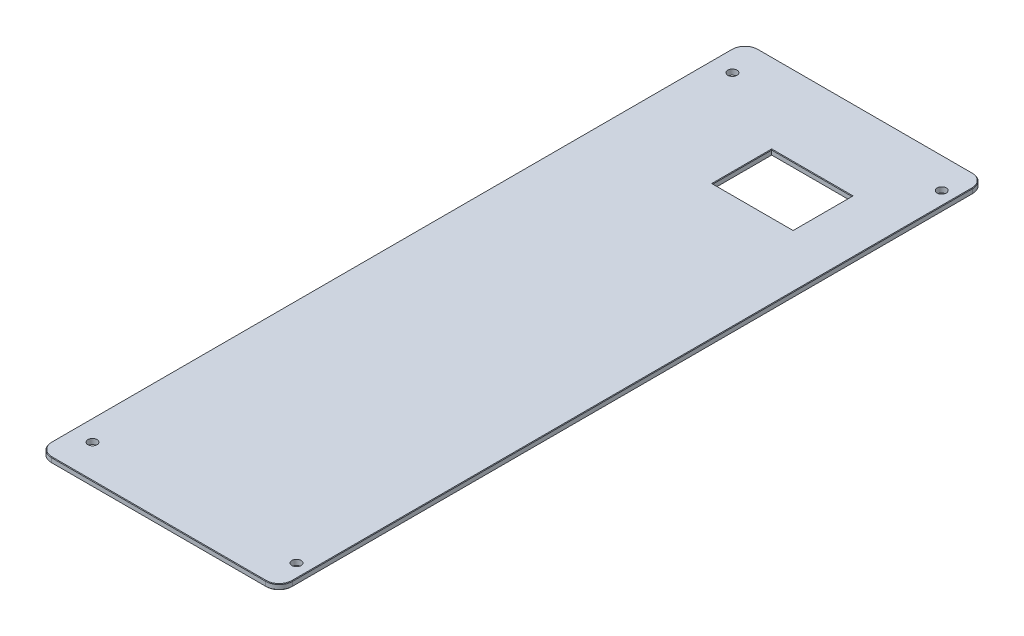
ISO-10303-21;
HEADER;
FILE_DESCRIPTION(('STEP AP214'),'2;1');
FILE_NAME('part.step','',(''),(''),'','','');
FILE_SCHEMA(('AUTOMOTIVE_DESIGN { 1 0 10303 214 1 1 1 1 }'));
ENDSEC;
DATA;
#1=APPLICATION_CONTEXT('core data for automotive mechanical design processes');
#2=APPLICATION_PROTOCOL_DEFINITION('international standard','automotive_design',2000,#1);
#3=PRODUCT_CONTEXT('',#1,'mechanical');
#4=PRODUCT('Part','Part','',(#3));
#5=PRODUCT_RELATED_PRODUCT_CATEGORY('part','',(#4));
#6=PRODUCT_DEFINITION_FORMATION('','',#4);
#7=PRODUCT_DEFINITION_CONTEXT('part definition',#1,'design');
#8=PRODUCT_DEFINITION('design','',#6,#7);
#9=PRODUCT_DEFINITION_SHAPE('','',#8);
#10=(LENGTH_UNIT() NAMED_UNIT(*) SI_UNIT(.MILLI.,.METRE.));
#11=(NAMED_UNIT(*) PLANE_ANGLE_UNIT() SI_UNIT($,.RADIAN.));
#12=(NAMED_UNIT(*) SI_UNIT($,.STERADIAN.) SOLID_ANGLE_UNIT());
#13=UNCERTAINTY_MEASURE_WITH_UNIT(LENGTH_MEASURE(1.E-05),#10,'distance_accuracy_value','');
#14=(GEOMETRIC_REPRESENTATION_CONTEXT(3) GLOBAL_UNCERTAINTY_ASSIGNED_CONTEXT((#13)) GLOBAL_UNIT_ASSIGNED_CONTEXT((#10,
#11,#12)) REPRESENTATION_CONTEXT('',''));
#15=CARTESIAN_POINT('',(0.,0.,0.));
#16=DIRECTION('',(0.,0.,1.));
#17=DIRECTION('',(1.,0.,0.));
#18=AXIS2_PLACEMENT_3D('',#15,#16,#17);
#19=CARTESIAN_POINT('',(0.,0.,264.));
#20=DIRECTION('',(-1.,0.,0.));
#21=DIRECTION('',(0.,0.,1.));
#22=AXIS2_PLACEMENT_3D('',#19,#20,#21);
#23=PLANE('',#22);
#24=DIRECTION('',(0.,1.,0.));
#25=VECTOR('',#24,1.);
#26=CARTESIAN_POINT('',(0.,0.,259.));
#27=LINE('',#26,#25);
#28=CARTESIAN_POINT('',(0.,0.200000000000001,259.));
#29=VERTEX_POINT('',#28);
#30=CARTESIAN_POINT('',(0.,1.8,259.));
#31=VERTEX_POINT('',#30);
#32=EDGE_CURVE('E412',#29,#31,#27,.T.);
#33=ORIENTED_EDGE('',*,*,#32,.T.);
#34=DIRECTION('',(0.,0.,-1.));
#35=VECTOR('',#34,1.);
#36=CARTESIAN_POINT('',(0.,1.8,5.));
#37=LINE('',#36,#35);
#38=CARTESIAN_POINT('',(0.,1.8,5.));
#39=VERTEX_POINT('',#38);
#40=EDGE_CURVE('E251',#31,#39,#37,.T.);
#41=ORIENTED_EDGE('',*,*,#40,.T.);
#42=DIRECTION('',(0.,1.,0.));
#43=VECTOR('',#42,1.);
#44=CARTESIAN_POINT('',(0.,0.,5.));
#45=LINE('',#44,#43);
#46=CARTESIAN_POINT('',(0.,0.200000000000001,5.));
#47=VERTEX_POINT('',#46);
#48=EDGE_CURVE('E409',#39,#47,#45,.F.);
#49=ORIENTED_EDGE('',*,*,#48,.T.);
#50=DIRECTION('',(0.,0.,1.));
#51=VECTOR('',#50,1.);
#52=CARTESIAN_POINT('',(0.,0.200000000000001,259.));
#53=LINE('',#52,#51);
#54=EDGE_CURVE('E249',#47,#29,#53,.T.);
#55=ORIENTED_EDGE('',*,*,#54,.T.);
#56=EDGE_LOOP('',(#33,#41,#49,#55));
#57=FACE_BOUND('',#56,.T.);
#58=ADVANCED_FACE('F30',(#57),#23,.T.);
#59=CARTESIAN_POINT('',(0.,0.,264.));
#60=DIRECTION('',(0.,1.,0.));
#61=DIRECTION('',(0.,0.,1.));
#62=AXIS2_PLACEMENT_3D('',#59,#60,#61);
#63=PLANE('',#62);
#64=CARTESIAN_POINT('',(85.,0.,11.5));
#65=DIRECTION('',(0.,1.,0.));
#66=DIRECTION('',(-1.,0.,0.));
#67=AXIS2_PLACEMENT_3D('',#64,#65,#66);
#68=CIRCLE('',#67,1.7);
#69=CARTESIAN_POINT('',(83.3,0.,11.5));
#70=VERTEX_POINT('',#69);
#71=EDGE_CURVE('E601',#70,#70,#68,.T.);
#72=ORIENTED_EDGE('',*,*,#71,.T.);
#73=EDGE_LOOP('',(#72));
#74=FACE_BOUND('',#73,.T.);
#75=CARTESIAN_POINT('',(85.,0.,252.5));
#76=DIRECTION('',(0.,1.,0.));
#77=DIRECTION('',(-1.,0.,0.));
#78=AXIS2_PLACEMENT_3D('',#75,#76,#77);
#79=CIRCLE('',#78,1.69999999999999);
#80=CARTESIAN_POINT('',(83.3,0.,252.5));
#81=VERTEX_POINT('',#80);
#82=EDGE_CURVE('E597',#81,#81,#79,.T.);
#83=ORIENTED_EDGE('',*,*,#82,.T.);
#84=EDGE_LOOP('',(#83));
#85=FACE_BOUND('',#84,.T.);
#86=CARTESIAN_POINT('',(7.82000000000003,0.,12.49));
#87=DIRECTION('',(0.,1.,0.));
#88=DIRECTION('',(-1.,0.,0.));
#89=AXIS2_PLACEMENT_3D('',#86,#87,#88);
#90=CIRCLE('',#89,1.7);
#91=CARTESIAN_POINT('',(6.12000000000003,0.,12.49));
#92=VERTEX_POINT('',#91);
#93=EDGE_CURVE('E592',#92,#92,#90,.T.);
#94=ORIENTED_EDGE('',*,*,#93,.T.);
#95=EDGE_LOOP('',(#94));
#96=FACE_BOUND('',#95,.T.);
#97=CARTESIAN_POINT('',(7.82,0.,251.51));
#98=DIRECTION('',(0.,1.,0.));
#99=DIRECTION('',(-1.,0.,0.));
#100=AXIS2_PLACEMENT_3D('',#97,#98,#99);
#101=CIRCLE('',#100,1.69999999999999);
#102=CARTESIAN_POINT('',(6.12000000000001,0.,251.51));
#103=VERTEX_POINT('',#102);
#104=EDGE_CURVE('E446',#103,#103,#101,.T.);
#105=ORIENTED_EDGE('',*,*,#104,.T.);
#106=EDGE_LOOP('',(#105));
#107=FACE_BOUND('',#106,.T.);
#108=DIRECTION('',(0.,0.,-1.));
#109=VECTOR('',#108,1.);
#110=CARTESIAN_POINT('',(0.200000000000004,0.,5.));
#111=LINE('',#110,#109);
#112=CARTESIAN_POINT('',(0.200000000000004,0.,259.));
#113=VERTEX_POINT('',#112);
#114=CARTESIAN_POINT('',(0.200000000000004,0.,5.));
#115=VERTEX_POINT('',#114);
#116=EDGE_CURVE('E37',#113,#115,#111,.T.);
#117=ORIENTED_EDGE('',*,*,#116,.T.);
#118=CARTESIAN_POINT('',(5.,0.,5.));
#119=DIRECTION('',(0.,1.,0.));
#120=DIRECTION('',(0.,0.,1.));
#121=AXIS2_PLACEMENT_3D('',#118,#119,#120);
#122=CIRCLE('',#121,4.8);
#123=CARTESIAN_POINT('',(5.,0.,0.199999999999978));
#124=VERTEX_POINT('',#123);
#125=EDGE_CURVE('E11',#115,#124,#122,.F.);
#126=ORIENTED_EDGE('',*,*,#125,.T.);
#127=DIRECTION('',(1.,0.,0.));
#128=VECTOR('',#127,1.);
#129=CARTESIAN_POINT('',(85.,0.,0.199999999999978));
#130=LINE('',#129,#128);
#131=CARTESIAN_POINT('',(85.,0.,0.199999999999978));
#132=VERTEX_POINT('',#131);
#133=EDGE_CURVE('E295',#124,#132,#130,.T.);
#134=ORIENTED_EDGE('',*,*,#133,.T.);
#135=CARTESIAN_POINT('',(85.,0.,5.));
#136=DIRECTION('',(0.,1.,0.));
#137=DIRECTION('',(0.,0.,1.));
#138=AXIS2_PLACEMENT_3D('',#135,#136,#137);
#139=CIRCLE('',#138,4.8);
#140=CARTESIAN_POINT('',(89.8,0.,5.));
#141=VERTEX_POINT('',#140);
#142=EDGE_CURVE('E297',#132,#141,#139,.F.);
#143=ORIENTED_EDGE('',*,*,#142,.T.);
#144=DIRECTION('',(0.,0.,1.));
#145=VECTOR('',#144,1.);
#146=CARTESIAN_POINT('',(89.8,0.,259.));
#147=LINE('',#146,#145);
#148=CARTESIAN_POINT('',(89.8,0.,259.));
#149=VERTEX_POINT('',#148);
#150=EDGE_CURVE('E299',#141,#149,#147,.T.);
#151=ORIENTED_EDGE('',*,*,#150,.T.);
#152=CARTESIAN_POINT('',(85.,0.,259.));
#153=DIRECTION('',(0.,1.,0.));
#154=DIRECTION('',(0.,0.,1.));
#155=AXIS2_PLACEMENT_3D('',#152,#153,#154);
#156=CIRCLE('',#155,4.79999999999997);
#157=CARTESIAN_POINT('',(85.,0.,263.8));
#158=VERTEX_POINT('',#157);
#159=EDGE_CURVE('E301',#149,#158,#156,.F.);
#160=ORIENTED_EDGE('',*,*,#159,.T.);
#161=DIRECTION('',(-1.,0.,0.));
#162=VECTOR('',#161,1.);
#163=CARTESIAN_POINT('',(0.,0.,263.8));
#164=LINE('',#163,#162);
#165=CARTESIAN_POINT('',(5.,0.,263.8));
#166=VERTEX_POINT('',#165);
#167=EDGE_CURVE('E303',#158,#166,#164,.T.);
#168=ORIENTED_EDGE('',*,*,#167,.T.);
#169=CARTESIAN_POINT('',(5.,0.,259.));
#170=DIRECTION('',(0.,1.,0.));
#171=DIRECTION('',(0.,0.,1.));
#172=AXIS2_PLACEMENT_3D('',#169,#170,#171);
#173=CIRCLE('',#172,4.8);
#174=EDGE_CURVE('E47',#166,#113,#173,.F.);
#175=ORIENTED_EDGE('',*,*,#174,.T.);
#176=EDGE_LOOP('',(#117,#126,#134,#143,#151,#160,#168,#175));
#177=FACE_BOUND('',#176,.T.);
#178=DIRECTION('',(-1.,0.,0.));
#179=VECTOR('',#178,1.);
#180=CARTESIAN_POINT('',(40.,0.,29.8));
#181=LINE('',#180,#179);
#182=CARTESIAN_POINT('',(70.2,0.,29.8));
#183=VERTEX_POINT('',#182);
#184=CARTESIAN_POINT('',(39.8,0.,29.8));
#185=VERTEX_POINT('',#184);
#186=EDGE_CURVE('E290',#183,#185,#181,.T.);
#187=ORIENTED_EDGE('',*,*,#186,.T.);
#188=DIRECTION('',(0.,0.,1.));
#189=VECTOR('',#188,1.);
#190=CARTESIAN_POINT('',(39.8,0.,264.));
#191=LINE('',#190,#189);
#192=CARTESIAN_POINT('',(39.8,0.,52.2));
#193=VERTEX_POINT('',#192);
#194=EDGE_CURVE('E292',#185,#193,#191,.T.);
#195=ORIENTED_EDGE('',*,*,#194,.T.);
#196=DIRECTION('',(1.,0.,0.));
#197=VECTOR('',#196,1.);
#198=CARTESIAN_POINT('',(70.,0.,52.2));
#199=LINE('',#198,#197);
#200=CARTESIAN_POINT('',(70.2,0.,52.2));
#201=VERTEX_POINT('',#200);
#202=EDGE_CURVE('E286',#193,#201,#199,.T.);
#203=ORIENTED_EDGE('',*,*,#202,.T.);
#204=DIRECTION('',(0.,0.,-1.));
#205=VECTOR('',#204,1.);
#206=CARTESIAN_POINT('',(70.2,0.,264.));
#207=LINE('',#206,#205);
#208=EDGE_CURVE('E288',#201,#183,#207,.T.);
#209=ORIENTED_EDGE('',*,*,#208,.T.);
#210=EDGE_LOOP('',(#187,#195,#203,#209));
#211=FACE_BOUND('',#210,.T.);
#212=ADVANCED_FACE('F307',(#74,#85,#96,#107,#177,#211),#63,.F.);
#213=CARTESIAN_POINT('',(90.,1.99999999999999,264.));
#214=DIRECTION('',(1.,0.,0.));
#215=DIRECTION('',(0.,0.,-1.));
#216=AXIS2_PLACEMENT_3D('',#213,#214,#215);
#217=PLANE('',#216);
#218=DIRECTION('',(0.,-1.,0.));
#219=VECTOR('',#218,1.);
#220=CARTESIAN_POINT('',(90.,1.99999999999999,5.));
#221=LINE('',#220,#219);
#222=CARTESIAN_POINT('',(90.,0.200000000000001,5.));
#223=VERTEX_POINT('',#222);
#224=CARTESIAN_POINT('',(90.,1.79999999999999,5.));
#225=VERTEX_POINT('',#224);
#226=EDGE_CURVE('E406',#223,#225,#221,.F.);
#227=ORIENTED_EDGE('',*,*,#226,.T.);
#228=DIRECTION('',(0.,0.,1.));
#229=VECTOR('',#228,1.);
#230=CARTESIAN_POINT('',(90.,1.79999999999999,259.));
#231=LINE('',#230,#229);
#232=CARTESIAN_POINT('',(90.,1.79999999999999,259.));
#233=VERTEX_POINT('',#232);
#234=EDGE_CURVE('E268',#225,#233,#231,.T.);
#235=ORIENTED_EDGE('',*,*,#234,.T.);
#236=DIRECTION('',(0.,-1.,0.));
#237=VECTOR('',#236,1.);
#238=CARTESIAN_POINT('',(90.,1.99999999999999,259.));
#239=LINE('',#238,#237);
#240=CARTESIAN_POINT('',(90.,0.200000000000004,259.));
#241=VERTEX_POINT('',#240);
#242=EDGE_CURVE('E403',#233,#241,#239,.T.);
#243=ORIENTED_EDGE('',*,*,#242,.T.);
#244=DIRECTION('',(0.,0.,-1.));
#245=VECTOR('',#244,1.);
#246=CARTESIAN_POINT('',(90.,0.200000000000004,5.));
#247=LINE('',#246,#245);
#248=EDGE_CURVE('E266',#241,#223,#247,.T.);
#249=ORIENTED_EDGE('',*,*,#248,.T.);
#250=EDGE_LOOP('',(#227,#235,#243,#249));
#251=FACE_BOUND('',#250,.T.);
#252=ADVANCED_FACE('F489',(#251),#217,.T.);
#253=CARTESIAN_POINT('',(90.,1.99999999999999,264.));
#254=DIRECTION('',(0.,-1.,0.));
#255=DIRECTION('',(1.,0.,0.));
#256=AXIS2_PLACEMENT_3D('',#253,#254,#255);
#257=PLANE('',#256);
#258=CARTESIAN_POINT('',(85.,1.99999999999999,11.5));
#259=DIRECTION('',(0.,1.,0.));
#260=DIRECTION('',(-1.,0.,0.));
#261=AXIS2_PLACEMENT_3D('',#258,#259,#260);
#262=CIRCLE('',#261,1.7);
#263=CARTESIAN_POINT('',(83.3,1.99999999999999,11.5));
#264=VERTEX_POINT('',#263);
#265=EDGE_CURVE('E580',#264,#264,#262,.T.);
#266=ORIENTED_EDGE('',*,*,#265,.F.);
#267=EDGE_LOOP('',(#266));
#268=FACE_BOUND('',#267,.T.);
#269=CARTESIAN_POINT('',(85.,1.99999999999999,252.5));
#270=DIRECTION('',(0.,1.,0.));
#271=DIRECTION('',(-1.,0.,0.));
#272=AXIS2_PLACEMENT_3D('',#269,#270,#271);
#273=CIRCLE('',#272,1.69999999999999);
#274=CARTESIAN_POINT('',(83.3,1.99999999999999,252.5));
#275=VERTEX_POINT('',#274);
#276=EDGE_CURVE('E584',#275,#275,#273,.T.);
#277=ORIENTED_EDGE('',*,*,#276,.F.);
#278=EDGE_LOOP('',(#277));
#279=FACE_BOUND('',#278,.T.);
#280=CARTESIAN_POINT('',(7.82000000000003,2.,12.49));
#281=DIRECTION('',(0.,1.,0.));
#282=DIRECTION('',(-1.,0.,0.));
#283=AXIS2_PLACEMENT_3D('',#280,#281,#282);
#284=CIRCLE('',#283,1.7);
#285=CARTESIAN_POINT('',(6.12000000000003,2.,12.49));
#286=VERTEX_POINT('',#285);
#287=EDGE_CURVE('E588',#286,#286,#284,.T.);
#288=ORIENTED_EDGE('',*,*,#287,.F.);
#289=EDGE_LOOP('',(#288));
#290=FACE_BOUND('',#289,.T.);
#291=CARTESIAN_POINT('',(7.82,2.,251.51));
#292=DIRECTION('',(0.,1.,0.));
#293=DIRECTION('',(-1.,0.,0.));
#294=AXIS2_PLACEMENT_3D('',#291,#292,#293);
#295=CIRCLE('',#294,1.69999999999999);
#296=CARTESIAN_POINT('',(6.12000000000001,2.,251.51));
#297=VERTEX_POINT('',#296);
#298=EDGE_CURVE('E450',#297,#297,#295,.T.);
#299=ORIENTED_EDGE('',*,*,#298,.F.);
#300=EDGE_LOOP('',(#299));
#301=FACE_BOUND('',#300,.T.);
#302=DIRECTION('',(1.,0.,0.));
#303=VECTOR('',#302,1.);
#304=CARTESIAN_POINT('',(90.,1.99999999999999,263.8));
#305=LINE('',#304,#303);
#306=CARTESIAN_POINT('',(5.,2.,263.8));
#307=VERTEX_POINT('',#306);
#308=CARTESIAN_POINT('',(85.,1.99999999999999,263.8));
#309=VERTEX_POINT('',#308);
#310=EDGE_CURVE('E231',#307,#309,#305,.T.);
#311=ORIENTED_EDGE('',*,*,#310,.T.);
#312=CARTESIAN_POINT('',(85.,1.99999999999999,259.));
#313=DIRECTION('',(0.,-1.,0.));
#314=DIRECTION('',(1.,0.,0.));
#315=AXIS2_PLACEMENT_3D('',#312,#313,#314);
#316=CIRCLE('',#315,4.8);
#317=CARTESIAN_POINT('',(89.8,1.99999999999999,259.));
#318=VERTEX_POINT('',#317);
#319=EDGE_CURVE('E233',#309,#318,#316,.F.);
#320=ORIENTED_EDGE('',*,*,#319,.T.);
#321=DIRECTION('',(0.,0.,-1.));
#322=VECTOR('',#321,1.);
#323=CARTESIAN_POINT('',(89.8,1.99999999999999,5.));
#324=LINE('',#323,#322);
#325=CARTESIAN_POINT('',(89.8,1.99999999999999,5.));
#326=VERTEX_POINT('',#325);
#327=EDGE_CURVE('E215',#318,#326,#324,.T.);
#328=ORIENTED_EDGE('',*,*,#327,.T.);
#329=CARTESIAN_POINT('',(85.,1.99999999999999,5.));
#330=DIRECTION('',(0.,-1.,0.));
#331=DIRECTION('',(1.,0.,0.));
#332=AXIS2_PLACEMENT_3D('',#329,#330,#331);
#333=CIRCLE('',#332,4.8);
#334=CARTESIAN_POINT('',(85.,1.99999999999999,0.200000000000003));
#335=VERTEX_POINT('',#334);
#336=EDGE_CURVE('E217',#326,#335,#333,.F.);
#337=ORIENTED_EDGE('',*,*,#336,.T.);
#338=DIRECTION('',(-1.,0.,0.));
#339=VECTOR('',#338,1.);
#340=CARTESIAN_POINT('',(5.,2.,0.199999999999978));
#341=LINE('',#340,#339);
#342=CARTESIAN_POINT('',(5.,2.,0.199999999999978));
#343=VERTEX_POINT('',#342);
#344=EDGE_CURVE('E223',#335,#343,#341,.T.);
#345=ORIENTED_EDGE('',*,*,#344,.T.);
#346=CARTESIAN_POINT('',(5.,2.,5.));
#347=DIRECTION('',(0.,-1.,0.));
#348=DIRECTION('',(1.,0.,0.));
#349=AXIS2_PLACEMENT_3D('',#346,#347,#348);
#350=CIRCLE('',#349,4.8);
#351=CARTESIAN_POINT('',(0.200000000000004,2.,5.));
#352=VERTEX_POINT('',#351);
#353=EDGE_CURVE('E225',#343,#352,#350,.F.);
#354=ORIENTED_EDGE('',*,*,#353,.T.);
#355=DIRECTION('',(0.,0.,1.));
#356=VECTOR('',#355,1.);
#357=CARTESIAN_POINT('',(0.200000000000006,2.,259.));
#358=LINE('',#357,#356);
#359=CARTESIAN_POINT('',(0.200000000000006,2.,259.));
#360=VERTEX_POINT('',#359);
#361=EDGE_CURVE('E227',#352,#360,#358,.T.);
#362=ORIENTED_EDGE('',*,*,#361,.T.);
#363=CARTESIAN_POINT('',(5.,2.,259.));
#364=DIRECTION('',(0.,-1.,0.));
#365=DIRECTION('',(1.,0.,0.));
#366=AXIS2_PLACEMENT_3D('',#363,#364,#365);
#367=CIRCLE('',#366,4.79999999999997);
#368=EDGE_CURVE('E229',#360,#307,#367,.F.);
#369=ORIENTED_EDGE('',*,*,#368,.T.);
#370=EDGE_LOOP('',(#311,#320,#328,#337,#345,#354,#362,#369));
#371=FACE_BOUND('',#370,.T.);
#372=DIRECTION('',(-1.,0.,0.));
#373=VECTOR('',#372,1.);
#374=CARTESIAN_POINT('',(40.,2.,52.2));
#375=LINE('',#374,#373);
#376=CARTESIAN_POINT('',(70.2,1.99999999999999,52.2));
#377=VERTEX_POINT('',#376);
#378=CARTESIAN_POINT('',(39.8,2.,52.2));
#379=VERTEX_POINT('',#378);
#380=EDGE_CURVE('E214',#377,#379,#375,.T.);
#381=ORIENTED_EDGE('',*,*,#380,.T.);
#382=DIRECTION('',(0.,0.,-1.));
#383=VECTOR('',#382,1.);
#384=CARTESIAN_POINT('',(39.8,2.,264.));
#385=LINE('',#384,#383);
#386=CARTESIAN_POINT('',(39.8,2.,29.8));
#387=VERTEX_POINT('',#386);
#388=EDGE_CURVE('E193',#379,#387,#385,.T.);
#389=ORIENTED_EDGE('',*,*,#388,.T.);
#390=DIRECTION('',(1.,0.,0.));
#391=VECTOR('',#390,1.);
#392=CARTESIAN_POINT('',(70.,1.99999999999999,29.8));
#393=LINE('',#392,#391);
#394=CARTESIAN_POINT('',(70.2,1.99999999999999,29.8));
#395=VERTEX_POINT('',#394);
#396=EDGE_CURVE('E203',#387,#395,#393,.T.);
#397=ORIENTED_EDGE('',*,*,#396,.T.);
#398=DIRECTION('',(0.,0.,1.));
#399=VECTOR('',#398,1.);
#400=CARTESIAN_POINT('',(70.2,1.99999999999999,264.));
#401=LINE('',#400,#399);
#402=EDGE_CURVE('E209',#395,#377,#401,.T.);
#403=ORIENTED_EDGE('',*,*,#402,.T.);
#404=EDGE_LOOP('',(#381,#389,#397,#403));
#405=FACE_BOUND('',#404,.T.);
#406=ADVANCED_FACE('F212',(#268,#279,#290,#301,#371,#405),#257,.F.);
#407=CARTESIAN_POINT('',(0.,0.,264.));
#408=DIRECTION('',(0.,0.,-1.));
#409=DIRECTION('',(-1.,0.,0.));
#410=AXIS2_PLACEMENT_3D('',#407,#408,#409);
#411=PLANE('',#410);
#412=DIRECTION('',(0.,-1.,0.));
#413=VECTOR('',#412,1.);
#414=CARTESIAN_POINT('',(85.,1.99999999999999,264.));
#415=LINE('',#414,#413);
#416=CARTESIAN_POINT('',(85.,0.200000000000001,264.));
#417=VERTEX_POINT('',#416);
#418=CARTESIAN_POINT('',(85.,1.79999999999999,264.));
#419=VERTEX_POINT('',#418);
#420=EDGE_CURVE('E415',#417,#419,#415,.F.);
#421=ORIENTED_EDGE('',*,*,#420,.T.);
#422=DIRECTION('',(-1.,0.,0.));
#423=VECTOR('',#422,1.);
#424=CARTESIAN_POINT('',(0.,1.8,264.));
#425=LINE('',#424,#423);
#426=CARTESIAN_POINT('',(5.,1.8,264.));
#427=VERTEX_POINT('',#426);
#428=EDGE_CURVE('E243',#419,#427,#425,.T.);
#429=ORIENTED_EDGE('',*,*,#428,.T.);
#430=DIRECTION('',(0.,1.,0.));
#431=VECTOR('',#430,1.);
#432=CARTESIAN_POINT('',(5.,0.,264.));
#433=LINE('',#432,#431);
#434=CARTESIAN_POINT('',(5.,0.200000000000004,264.));
#435=VERTEX_POINT('',#434);
#436=EDGE_CURVE('E210',#427,#435,#433,.F.);
#437=ORIENTED_EDGE('',*,*,#436,.T.);
#438=DIRECTION('',(1.,0.,0.));
#439=VECTOR('',#438,1.);
#440=CARTESIAN_POINT('',(0.,0.200000000000004,264.));
#441=LINE('',#440,#439);
#442=EDGE_CURVE('E241',#435,#417,#441,.T.);
#443=ORIENTED_EDGE('',*,*,#442,.T.);
#444=EDGE_LOOP('',(#421,#429,#437,#443));
#445=FACE_BOUND('',#444,.T.);
#446=ADVANCED_FACE('F552',(#445),#411,.F.);
#447=CARTESIAN_POINT('',(0.,0.,0.));
#448=DIRECTION('',(0.,0.,-1.));
#449=DIRECTION('',(-1.,0.,0.));
#450=AXIS2_PLACEMENT_3D('',#447,#448,#449);
#451=PLANE('',#450);
#452=DIRECTION('',(0.,1.,0.));
#453=VECTOR('',#452,1.);
#454=CARTESIAN_POINT('',(5.,0.,0.));
#455=LINE('',#454,#453);
#456=CARTESIAN_POINT('',(5.,0.200000000000001,0.));
#457=VERTEX_POINT('',#456);
#458=CARTESIAN_POINT('',(5.,1.8,0.));
#459=VERTEX_POINT('',#458);
#460=EDGE_CURVE('E389',#457,#459,#455,.T.);
#461=ORIENTED_EDGE('',*,*,#460,.T.);
#462=DIRECTION('',(1.,0.,0.));
#463=VECTOR('',#462,1.);
#464=CARTESIAN_POINT('',(85.,1.79999999999999,0.));
#465=LINE('',#464,#463);
#466=CARTESIAN_POINT('',(85.,1.79999999999999,0.));
#467=VERTEX_POINT('',#466);
#468=EDGE_CURVE('E260',#459,#467,#465,.T.);
#469=ORIENTED_EDGE('',*,*,#468,.T.);
#470=DIRECTION('',(0.,-1.,0.));
#471=VECTOR('',#470,1.);
#472=CARTESIAN_POINT('',(85.,0.,0.));
#473=LINE('',#472,#471);
#474=CARTESIAN_POINT('',(85.,0.200000000000001,0.));
#475=VERTEX_POINT('',#474);
#476=EDGE_CURVE('E400',#467,#475,#473,.T.);
#477=ORIENTED_EDGE('',*,*,#476,.T.);
#478=DIRECTION('',(-1.,0.,0.));
#479=VECTOR('',#478,1.);
#480=CARTESIAN_POINT('',(5.,0.200000000000001,0.));
#481=LINE('',#480,#479);
#482=EDGE_CURVE('E258',#475,#457,#481,.T.);
#483=ORIENTED_EDGE('',*,*,#482,.T.);
#484=EDGE_LOOP('',(#461,#469,#477,#483));
#485=FACE_BOUND('',#484,.T.);
#486=ADVANCED_FACE('F520',(#485),#451,.T.);
#487=CARTESIAN_POINT('',(70.,0.,52.));
#488=DIRECTION('',(1.,0.,0.));
#489=DIRECTION('',(0.,1.,0.));
#490=AXIS2_PLACEMENT_3D('',#487,#488,#489);
#491=PLANE('',#490);
#492=DIRECTION('',(0.,1.,0.));
#493=VECTOR('',#492,1.);
#494=CARTESIAN_POINT('',(70.,0.,52.));
#495=LINE('',#494,#493);
#496=CARTESIAN_POINT('',(70.,0.200000000000004,52.));
#497=VERTEX_POINT('',#496);
#498=CARTESIAN_POINT('',(70.,1.79999999999999,52.));
#499=VERTEX_POINT('',#498);
#500=EDGE_CURVE('E386',#497,#499,#495,.T.);
#501=ORIENTED_EDGE('',*,*,#500,.T.);
#502=DIRECTION('',(0.,0.,-1.));
#503=VECTOR('',#502,1.);
#504=CARTESIAN_POINT('',(70.,1.79999999999999,52.));
#505=LINE('',#504,#503);
#506=CARTESIAN_POINT('',(70.,1.79999999999999,30.));
#507=VERTEX_POINT('',#506);
#508=EDGE_CURVE('E280',#499,#507,#505,.T.);
#509=ORIENTED_EDGE('',*,*,#508,.T.);
#510=DIRECTION('',(0.,1.,0.));
#511=VECTOR('',#510,1.);
#512=CARTESIAN_POINT('',(70.,0.,30.));
#513=LINE('',#512,#511);
#514=CARTESIAN_POINT('',(70.,0.200000000000001,30.));
#515=VERTEX_POINT('',#514);
#516=EDGE_CURVE('E385',#515,#507,#513,.T.);
#517=ORIENTED_EDGE('',*,*,#516,.F.);
#518=DIRECTION('',(0.,0.,1.));
#519=VECTOR('',#518,1.);
#520=CARTESIAN_POINT('',(70.,0.200000000000001,52.));
#521=LINE('',#520,#519);
#522=EDGE_CURVE('E278',#515,#497,#521,.T.);
#523=ORIENTED_EDGE('',*,*,#522,.T.);
#524=EDGE_LOOP('',(#501,#509,#517,#523));
#525=FACE_BOUND('',#524,.T.);
#526=ADVANCED_FACE('F469',(#525),#491,.F.);
#527=CARTESIAN_POINT('',(70.,0.,52.));
#528=DIRECTION('',(0.,0.,-1.));
#529=DIRECTION('',(-1.,0.,0.));
#530=AXIS2_PLACEMENT_3D('',#527,#528,#529);
#531=PLANE('',#530);
#532=DIRECTION('',(0.,1.,0.));
#533=VECTOR('',#532,1.);
#534=CARTESIAN_POINT('',(40.,0.,52.));
#535=LINE('',#534,#533);
#536=CARTESIAN_POINT('',(40.,0.200000000000004,52.));
#537=VERTEX_POINT('',#536);
#538=CARTESIAN_POINT('',(40.,1.79999999999999,52.));
#539=VERTEX_POINT('',#538);
#540=EDGE_CURVE('E390',#537,#539,#535,.T.);
#541=ORIENTED_EDGE('',*,*,#540,.T.);
#542=DIRECTION('',(1.,0.,0.));
#543=VECTOR('',#542,1.);
#544=CARTESIAN_POINT('',(70.,1.79999999999999,52.));
#545=LINE('',#544,#543);
#546=EDGE_CURVE('E276',#539,#499,#545,.T.);
#547=ORIENTED_EDGE('',*,*,#546,.T.);
#548=ORIENTED_EDGE('',*,*,#500,.F.);
#549=DIRECTION('',(-1.,0.,0.));
#550=VECTOR('',#549,1.);
#551=CARTESIAN_POINT('',(40.,0.200000000000004,52.));
#552=LINE('',#551,#550);
#553=EDGE_CURVE('E274',#497,#537,#552,.T.);
#554=ORIENTED_EDGE('',*,*,#553,.T.);
#555=EDGE_LOOP('',(#541,#547,#548,#554));
#556=FACE_BOUND('',#555,.T.);
#557=ADVANCED_FACE('F433',(#556),#531,.T.);
#558=CARTESIAN_POINT('',(40.,0.,30.));
#559=DIRECTION('',(-1.,0.,0.));
#560=DIRECTION('',(0.,-1.,0.));
#561=AXIS2_PLACEMENT_3D('',#558,#559,#560);
#562=PLANE('',#561);
#563=DIRECTION('',(0.,1.,0.));
#564=VECTOR('',#563,1.);
#565=CARTESIAN_POINT('',(40.,0.,30.));
#566=LINE('',#565,#564);
#567=CARTESIAN_POINT('',(40.,0.200000000000004,30.));
#568=VERTEX_POINT('',#567);
#569=CARTESIAN_POINT('',(40.,1.79999999999999,30.));
#570=VERTEX_POINT('',#569);
#571=EDGE_CURVE('E393',#568,#570,#566,.T.);
#572=ORIENTED_EDGE('',*,*,#571,.T.);
#573=DIRECTION('',(0.,0.,1.));
#574=VECTOR('',#573,1.);
#575=CARTESIAN_POINT('',(40.,1.79999999999999,30.));
#576=LINE('',#575,#574);
#577=EDGE_CURVE('E196',#570,#539,#576,.T.);
#578=ORIENTED_EDGE('',*,*,#577,.T.);
#579=ORIENTED_EDGE('',*,*,#540,.F.);
#580=DIRECTION('',(0.,0.,-1.));
#581=VECTOR('',#580,1.);
#582=CARTESIAN_POINT('',(40.,0.200000000000001,30.));
#583=LINE('',#582,#581);
#584=EDGE_CURVE('E270',#537,#568,#583,.T.);
#585=ORIENTED_EDGE('',*,*,#584,.T.);
#586=EDGE_LOOP('',(#572,#578,#579,#585));
#587=FACE_BOUND('',#586,.T.);
#588=ADVANCED_FACE('F430',(#587),#562,.F.);
#589=CARTESIAN_POINT('',(40.,0.,30.));
#590=DIRECTION('',(0.,0.,1.));
#591=DIRECTION('',(1.,0.,0.));
#592=AXIS2_PLACEMENT_3D('',#589,#590,#591);
#593=PLANE('',#592);
#594=ORIENTED_EDGE('',*,*,#516,.T.);
#595=DIRECTION('',(-1.,0.,0.));
#596=VECTOR('',#595,1.);
#597=CARTESIAN_POINT('',(40.,1.79999999999999,30.));
#598=LINE('',#597,#596);
#599=EDGE_CURVE('E284',#507,#570,#598,.T.);
#600=ORIENTED_EDGE('',*,*,#599,.T.);
#601=ORIENTED_EDGE('',*,*,#571,.F.);
#602=DIRECTION('',(1.,0.,0.));
#603=VECTOR('',#602,1.);
#604=CARTESIAN_POINT('',(70.,0.200000000000004,30.));
#605=LINE('',#604,#603);
#606=EDGE_CURVE('E282',#568,#515,#605,.T.);
#607=ORIENTED_EDGE('',*,*,#606,.T.);
#608=EDGE_LOOP('',(#594,#600,#601,#607));
#609=FACE_BOUND('',#608,.T.);
#610=ADVANCED_FACE('F471',(#609),#593,.T.);
#611=CARTESIAN_POINT('',(85.,0.,5.));
#612=DIRECTION('',(0.,-1.,0.));
#613=DIRECTION('',(0.,0.,-1.));
#614=AXIS2_PLACEMENT_3D('',#611,#612,#613);
#615=CYLINDRICAL_SURFACE('',#614,5.);
#616=ORIENTED_EDGE('',*,*,#476,.F.);
#617=CARTESIAN_POINT('',(85.,1.79999999999999,5.));
#618=DIRECTION('',(0.,-1.,0.));
#619=DIRECTION('',(0.,0.,-1.));
#620=AXIS2_PLACEMENT_3D('',#617,#618,#619);
#621=CIRCLE('',#620,5.);
#622=EDGE_CURVE('E264',#467,#225,#621,.T.);
#623=ORIENTED_EDGE('',*,*,#622,.T.);
#624=ORIENTED_EDGE('',*,*,#226,.F.);
#625=CARTESIAN_POINT('',(85.,0.200000000000001,5.));
#626=DIRECTION('',(0.,1.,0.));
#627=DIRECTION('',(0.,0.,1.));
#628=AXIS2_PLACEMENT_3D('',#625,#626,#627);
#629=CIRCLE('',#628,5.);
#630=EDGE_CURVE('E262',#223,#475,#629,.T.);
#631=ORIENTED_EDGE('',*,*,#630,.T.);
#632=EDGE_LOOP('',(#616,#623,#624,#631));
#633=FACE_BOUND('',#632,.T.);
#634=ADVANCED_FACE('F473',(#633),#615,.T.);
#635=CARTESIAN_POINT('',(5.,0.,259.));
#636=DIRECTION('',(0.,-1.,0.));
#637=DIRECTION('',(0.,0.,-1.));
#638=AXIS2_PLACEMENT_3D('',#635,#636,#637);
#639=CYLINDRICAL_SURFACE('',#638,5.);
#640=ORIENTED_EDGE('',*,*,#436,.F.);
#641=CARTESIAN_POINT('',(5.,1.8,259.));
#642=DIRECTION('',(0.,-1.,0.));
#643=DIRECTION('',(0.,0.,-1.));
#644=AXIS2_PLACEMENT_3D('',#641,#642,#643);
#645=CIRCLE('',#644,5.);
#646=EDGE_CURVE('E247',#427,#31,#645,.T.);
#647=ORIENTED_EDGE('',*,*,#646,.T.);
#648=ORIENTED_EDGE('',*,*,#32,.F.);
#649=CARTESIAN_POINT('',(5.,0.200000000000001,259.));
#650=DIRECTION('',(0.,1.,0.));
#651=DIRECTION('',(0.,0.,1.));
#652=AXIS2_PLACEMENT_3D('',#649,#650,#651);
#653=CIRCLE('',#652,5.);
#654=EDGE_CURVE('E245',#29,#435,#653,.T.);
#655=ORIENTED_EDGE('',*,*,#654,.T.);
#656=EDGE_LOOP('',(#640,#647,#648,#655));
#657=FACE_BOUND('',#656,.T.);
#658=ADVANCED_FACE('F479',(#657),#639,.T.);
#659=CARTESIAN_POINT('',(85.,1.99999999999999,259.));
#660=DIRECTION('',(0.,1.,0.));
#661=DIRECTION('',(0.,0.,1.));
#662=AXIS2_PLACEMENT_3D('',#659,#660,#661);
#663=CYLINDRICAL_SURFACE('',#662,5.);
#664=ORIENTED_EDGE('',*,*,#242,.F.);
#665=CARTESIAN_POINT('',(85.,1.79999999999999,259.));
#666=DIRECTION('',(0.,-1.,0.));
#667=DIRECTION('',(0.,0.,-1.));
#668=AXIS2_PLACEMENT_3D('',#665,#666,#667);
#669=CIRCLE('',#668,5.);
#670=EDGE_CURVE('E238',#233,#419,#669,.T.);
#671=ORIENTED_EDGE('',*,*,#670,.T.);
#672=ORIENTED_EDGE('',*,*,#420,.F.);
#673=CARTESIAN_POINT('',(85.,0.200000000000001,259.));
#674=DIRECTION('',(0.,1.,0.));
#675=DIRECTION('',(0.,0.,1.));
#676=AXIS2_PLACEMENT_3D('',#673,#674,#675);
#677=CIRCLE('',#676,5.);
#678=EDGE_CURVE('E236',#417,#241,#677,.T.);
#679=ORIENTED_EDGE('',*,*,#678,.T.);
#680=EDGE_LOOP('',(#664,#671,#672,#679));
#681=FACE_BOUND('',#680,.T.);
#682=ADVANCED_FACE('F541',(#681),#663,.T.);
#683=CARTESIAN_POINT('',(5.,0.,5.));
#684=DIRECTION('',(0.,1.,0.));
#685=DIRECTION('',(0.,0.,1.));
#686=AXIS2_PLACEMENT_3D('',#683,#684,#685);
#687=CYLINDRICAL_SURFACE('',#686,5.);
#688=ORIENTED_EDGE('',*,*,#48,.F.);
#689=CARTESIAN_POINT('',(5.,1.8,5.));
#690=DIRECTION('',(0.,-1.,0.));
#691=DIRECTION('',(0.,0.,-1.));
#692=AXIS2_PLACEMENT_3D('',#689,#690,#691);
#693=CIRCLE('',#692,5.);
#694=EDGE_CURVE('E256',#39,#459,#693,.T.);
#695=ORIENTED_EDGE('',*,*,#694,.T.);
#696=ORIENTED_EDGE('',*,*,#460,.F.);
#697=CARTESIAN_POINT('',(5.,0.200000000000001,5.));
#698=DIRECTION('',(0.,1.,0.));
#699=DIRECTION('',(0.,0.,1.));
#700=AXIS2_PLACEMENT_3D('',#697,#698,#699);
#701=CIRCLE('',#700,5.);
#702=EDGE_CURVE('E253',#457,#47,#701,.T.);
#703=ORIENTED_EDGE('',*,*,#702,.T.);
#704=EDGE_LOOP('',(#688,#695,#696,#703));
#705=FACE_BOUND('',#704,.T.);
#706=ADVANCED_FACE('F518',(#705),#687,.T.);
#707=CARTESIAN_POINT('',(5.,2.,5.));
#708=DIRECTION('',(0.,-1.,0.));
#709=DIRECTION('',(0.,0.,-1.));
#710=AXIS2_PLACEMENT_3D('',#707,#708,#709);
#711=CONICAL_SURFACE('',#710,4.8,0.785398163397452);
#712=DIRECTION('',(0.,0.707106781186543,0.707106781186552));
#713=VECTOR('',#712,1.);
#714=CARTESIAN_POINT('',(5.,1.8,0.));
#715=LINE('',#714,#713);
#716=EDGE_CURVE('E379',#459,#343,#715,.T.);
#717=ORIENTED_EDGE('',*,*,#716,.F.);
#718=ORIENTED_EDGE('',*,*,#694,.F.);
#719=DIRECTION('',(-0.707106781186551,-0.707106781186544,0.));
#720=VECTOR('',#719,1.);
#721=CARTESIAN_POINT('',(0.200000000000004,2.,5.));
#722=LINE('',#721,#720);
#723=EDGE_CURVE('E382',#352,#39,#722,.T.);
#724=ORIENTED_EDGE('',*,*,#723,.F.);
#725=ORIENTED_EDGE('',*,*,#353,.F.);
#726=EDGE_LOOP('',(#717,#718,#724,#725));
#727=FACE_BOUND('',#726,.T.);
#728=ADVANCED_FACE('F514',(#727),#711,.T.);
#729=CARTESIAN_POINT('',(0.,1.8,264.));
#730=DIRECTION('',(-0.707106781186544,0.707106781186551,0.));
#731=DIRECTION('',(-0.707106781186551,-0.707106781186544,0.));
#732=AXIS2_PLACEMENT_3D('',#729,#730,#731);
#733=PLANE('',#732);
#734=ORIENTED_EDGE('',*,*,#723,.T.);
#735=ORIENTED_EDGE('',*,*,#40,.F.);
#736=DIRECTION('',(-0.707106781186551,-0.707106781186544,0.));
#737=VECTOR('',#736,1.);
#738=CARTESIAN_POINT('',(0.200000000000006,2.,259.));
#739=LINE('',#738,#737);
#740=EDGE_CURVE('E376',#360,#31,#739,.T.);
#741=ORIENTED_EDGE('',*,*,#740,.F.);
#742=ORIENTED_EDGE('',*,*,#361,.F.);
#743=EDGE_LOOP('',(#734,#735,#741,#742));
#744=FACE_BOUND('',#743,.T.);
#745=ADVANCED_FACE('F498',(#744),#733,.T.);
#746=CARTESIAN_POINT('',(90.,1.99999999999999,0.199999999999978));
#747=DIRECTION('',(0.,0.707106781186506,-0.707106781186589));
#748=DIRECTION('',(0.,0.707106781186589,0.707106781186506));
#749=AXIS2_PLACEMENT_3D('',#746,#747,#748);
#750=PLANE('',#749);
#751=ORIENTED_EDGE('',*,*,#716,.T.);
#752=ORIENTED_EDGE('',*,*,#344,.F.);
#753=DIRECTION('',(0.,0.707106781186589,0.707106781186506));
#754=VECTOR('',#753,1.);
#755=CARTESIAN_POINT('',(85.,1.79999999999999,0.));
#756=LINE('',#755,#754);
#757=EDGE_CURVE('E373',#467,#335,#756,.T.);
#758=ORIENTED_EDGE('',*,*,#757,.F.);
#759=ORIENTED_EDGE('',*,*,#468,.F.);
#760=EDGE_LOOP('',(#751,#752,#758,#759));
#761=FACE_BOUND('',#760,.T.);
#762=ADVANCED_FACE('F526',(#761),#750,.T.);
#763=CARTESIAN_POINT('',(5.,2.,259.));
#764=DIRECTION('',(0.,-1.,0.));
#765=DIRECTION('',(0.,0.,-1.));
#766=AXIS2_PLACEMENT_3D('',#763,#764,#765);
#767=CONICAL_SURFACE('',#766,4.79999999999997,0.785398163397517);
#768=ORIENTED_EDGE('',*,*,#740,.T.);
#769=ORIENTED_EDGE('',*,*,#646,.F.);
#770=DIRECTION('',(0.,-0.707106781186491,0.707106781186604));
#771=VECTOR('',#770,1.);
#772=CARTESIAN_POINT('',(5.,2.,263.8));
#773=LINE('',#772,#771);
#774=EDGE_CURVE('E370',#307,#427,#773,.T.);
#775=ORIENTED_EDGE('',*,*,#774,.F.);
#776=ORIENTED_EDGE('',*,*,#368,.F.);
#777=EDGE_LOOP('',(#768,#769,#775,#776));
#778=FACE_BOUND('',#777,.T.);
#779=ADVANCED_FACE('F504',(#778),#767,.T.);
#780=CARTESIAN_POINT('',(85.,1.99999999999999,5.));
#781=DIRECTION('',(0.,-1.,0.));
#782=DIRECTION('',(0.,0.,-1.));
#783=AXIS2_PLACEMENT_3D('',#780,#781,#782);
#784=CONICAL_SURFACE('',#783,4.8,0.785398163397453);
#785=ORIENTED_EDGE('',*,*,#757,.T.);
#786=ORIENTED_EDGE('',*,*,#336,.F.);
#787=DIRECTION('',(-0.707106781186556,0.707106781186539,0.));
#788=VECTOR('',#787,1.);
#789=CARTESIAN_POINT('',(90.,1.79999999999999,5.));
#790=LINE('',#789,#788);
#791=EDGE_CURVE('E367',#225,#326,#790,.T.);
#792=ORIENTED_EDGE('',*,*,#791,.F.);
#793=ORIENTED_EDGE('',*,*,#622,.F.);
#794=EDGE_LOOP('',(#785,#786,#792,#793));
#795=FACE_BOUND('',#794,.T.);
#796=ADVANCED_FACE('F530',(#795),#784,.T.);
#797=CARTESIAN_POINT('',(0.,1.8,264.));
#798=DIRECTION('',(0.,-0.707106781186502,-0.707106781186593));
#799=DIRECTION('',(0.,0.707106781186593,-0.707106781186502));
#800=AXIS2_PLACEMENT_3D('',#797,#798,#799);
#801=PLANE('',#800);
#802=ORIENTED_EDGE('',*,*,#774,.T.);
#803=ORIENTED_EDGE('',*,*,#428,.F.);
#804=DIRECTION('',(0.,-0.707106781186592,0.707106781186503));
#805=VECTOR('',#804,1.);
#806=CARTESIAN_POINT('',(85.,1.99999999999999,263.8));
#807=LINE('',#806,#805);
#808=EDGE_CURVE('E365',#309,#419,#807,.T.);
#809=ORIENTED_EDGE('',*,*,#808,.F.);
#810=ORIENTED_EDGE('',*,*,#310,.F.);
#811=EDGE_LOOP('',(#802,#803,#809,#810));
#812=FACE_BOUND('',#811,.T.);
#813=ADVANCED_FACE('F549',(#812),#801,.F.);
#814=CARTESIAN_POINT('',(89.8,1.99999999999999,264.));
#815=DIRECTION('',(0.70710678118654,0.707106781186555,0.));
#816=DIRECTION('',(-0.707106781186555,0.70710678118654,0.));
#817=AXIS2_PLACEMENT_3D('',#814,#815,#816);
#818=PLANE('',#817);
#819=ORIENTED_EDGE('',*,*,#791,.T.);
#820=ORIENTED_EDGE('',*,*,#327,.F.);
#821=DIRECTION('',(-0.707106781186555,0.70710678118654,0.));
#822=VECTOR('',#821,1.);
#823=CARTESIAN_POINT('',(90.,1.79999999999999,259.));
#824=LINE('',#823,#822);
#825=EDGE_CURVE('E363',#233,#318,#824,.T.);
#826=ORIENTED_EDGE('',*,*,#825,.F.);
#827=ORIENTED_EDGE('',*,*,#234,.F.);
#828=EDGE_LOOP('',(#819,#820,#826,#827));
#829=FACE_BOUND('',#828,.T.);
#830=ADVANCED_FACE('F535',(#829),#818,.T.);
#831=CARTESIAN_POINT('',(85.,1.99999999999999,259.));
#832=DIRECTION('',(0.,-1.,0.));
#833=DIRECTION('',(0.,0.,-1.));
#834=AXIS2_PLACEMENT_3D('',#831,#832,#833);
#835=CONICAL_SURFACE('',#834,4.8,0.785398163397449);
#836=ORIENTED_EDGE('',*,*,#808,.T.);
#837=ORIENTED_EDGE('',*,*,#670,.F.);
#838=ORIENTED_EDGE('',*,*,#825,.T.);
#839=ORIENTED_EDGE('',*,*,#319,.F.);
#840=EDGE_LOOP('',(#836,#837,#838,#839));
#841=FACE_BOUND('',#840,.T.);
#842=ADVANCED_FACE('F545',(#841),#835,.T.);
#843=CARTESIAN_POINT('',(70.,1.79999999999999,52.));
#844=DIRECTION('',(0.707106781186543,-0.707106781186552,0.));
#845=DIRECTION('',(0.707106781186552,0.707106781186543,0.));
#846=AXIS2_PLACEMENT_3D('',#843,#844,#845);
#847=PLANE('',#846);
#848=DIRECTION('',(-0.577350269189626,-0.577350269189619,-0.577350269189632));
#849=VECTOR('',#848,1.);
#850=CARTESIAN_POINT('',(76.8,8.59999999999992,58.8000000000001));
#851=LINE('',#850,#849);
#852=EDGE_CURVE('E199',#377,#499,#851,.T.);
#853=ORIENTED_EDGE('',*,*,#852,.F.);
#854=ORIENTED_EDGE('',*,*,#402,.F.);
#855=DIRECTION('',(-0.577350269189614,-0.577350269189607,0.577350269189656));
#856=VECTOR('',#855,1.);
#857=CARTESIAN_POINT('',(62.6666666666664,-5.5333333333335,37.3333333333341));
#858=LINE('',#857,#856);
#859=EDGE_CURVE('E206',#507,#395,#858,.F.);
#860=ORIENTED_EDGE('',*,*,#859,.F.);
#861=ORIENTED_EDGE('',*,*,#508,.F.);
#862=EDGE_LOOP('',(#853,#854,#860,#861));
#863=FACE_BOUND('',#862,.T.);
#864=ADVANCED_FACE('F422',(#863),#847,.F.);
#865=CARTESIAN_POINT('',(90.,1.99999999999999,29.8));
#866=DIRECTION('',(0.,0.707106781186578,0.707106781186517));
#867=DIRECTION('',(0.,-0.707106781186517,0.707106781186578));
#868=AXIS2_PLACEMENT_3D('',#865,#866,#867);
#869=PLANE('',#868);
#870=ORIENTED_EDGE('',*,*,#859,.T.);
#871=ORIENTED_EDGE('',*,*,#396,.F.);
#872=DIRECTION('',(-0.5773502691896,0.577350269189614,-0.577350269189663));
#873=VECTOR('',#872,1.);
#874=CARTESIAN_POINT('',(40.,1.79999999999999,30.));
#875=LINE('',#874,#873);
#876=EDGE_CURVE('E189',#570,#387,#875,.T.);
#877=ORIENTED_EDGE('',*,*,#876,.F.);
#878=ORIENTED_EDGE('',*,*,#599,.F.);
#879=EDGE_LOOP('',(#870,#871,#877,#878));
#880=FACE_BOUND('',#879,.T.);
#881=ADVANCED_FACE('F204',(#880),#869,.T.);
#882=CARTESIAN_POINT('',(90.,1.99999999999999,52.2));
#883=DIRECTION('',(0.,0.707106781186555,-0.70710678118654));
#884=DIRECTION('',(0.,0.70710678118654,0.707106781186555));
#885=AXIS2_PLACEMENT_3D('',#882,#883,#884);
#886=PLANE('',#885);
#887=ORIENTED_EDGE('',*,*,#852,.T.);
#888=ORIENTED_EDGE('',*,*,#546,.F.);
#889=DIRECTION('',(0.577350269189613,-0.577350269189626,-0.577350269189639));
#890=VECTOR('',#889,1.);
#891=CARTESIAN_POINT('',(47.3333333333333,-5.53333333333352,44.6666666666664));
#892=LINE('',#891,#890);
#893=EDGE_CURVE('E200',#379,#539,#892,.T.);
#894=ORIENTED_EDGE('',*,*,#893,.F.);
#895=ORIENTED_EDGE('',*,*,#380,.F.);
#896=EDGE_LOOP('',(#887,#888,#894,#895));
#897=FACE_BOUND('',#896,.T.);
#898=ADVANCED_FACE('F425',(#897),#886,.T.);
#899=CARTESIAN_POINT('',(40.,1.79999999999999,30.));
#900=DIRECTION('',(-0.707106781186556,-0.707106781186539,0.));
#901=DIRECTION('',(0.707106781186539,-0.707106781186556,0.));
#902=AXIS2_PLACEMENT_3D('',#899,#900,#901);
#903=PLANE('',#902);
#904=ORIENTED_EDGE('',*,*,#876,.T.);
#905=ORIENTED_EDGE('',*,*,#388,.F.);
#906=ORIENTED_EDGE('',*,*,#893,.T.);
#907=ORIENTED_EDGE('',*,*,#577,.F.);
#908=EDGE_LOOP('',(#904,#905,#906,#907));
#909=FACE_BOUND('',#908,.T.);
#910=ADVANCED_FACE('F191',(#909),#903,.F.);
#911=CARTESIAN_POINT('',(85.,0.,259.));
#912=DIRECTION('',(0.,1.,0.));
#913=DIRECTION('',(0.,0.,1.));
#914=AXIS2_PLACEMENT_3D('',#911,#912,#913);
#915=CONICAL_SURFACE('',#914,4.79999999999997,0.785398163397518);
#916=DIRECTION('',(-0.707106781186604,-0.707106781186491,0.));
#917=VECTOR('',#916,1.);
#918=CARTESIAN_POINT('',(90.,0.200000000000001,259.));
#919=LINE('',#918,#917);
#920=EDGE_CURVE('E319',#241,#149,#919,.T.);
#921=ORIENTED_EDGE('',*,*,#920,.F.);
#922=ORIENTED_EDGE('',*,*,#678,.F.);
#923=DIRECTION('',(0.,0.707106781186491,0.707106781186604));
#924=VECTOR('',#923,1.);
#925=CARTESIAN_POINT('',(85.,0.,263.8));
#926=LINE('',#925,#924);
#927=EDGE_CURVE('E357',#158,#417,#926,.T.);
#928=ORIENTED_EDGE('',*,*,#927,.F.);
#929=ORIENTED_EDGE('',*,*,#159,.F.);
#930=EDGE_LOOP('',(#921,#922,#928,#929));
#931=FACE_BOUND('',#930,.T.);
#932=ADVANCED_FACE('F650',(#931),#915,.T.);
#933=CARTESIAN_POINT('',(0.,0.200000000000004,264.));
#934=DIRECTION('',(0.,0.707106781186502,-0.707106781186593));
#935=DIRECTION('',(0.,0.707106781186593,0.707106781186502));
#936=AXIS2_PLACEMENT_3D('',#933,#934,#935);
#937=PLANE('',#936);
#938=ORIENTED_EDGE('',*,*,#927,.T.);
#939=ORIENTED_EDGE('',*,*,#442,.F.);
#940=DIRECTION('',(0.,0.707106781186593,0.707106781186502));
#941=VECTOR('',#940,1.);
#942=CARTESIAN_POINT('',(5.,0.,263.8));
#943=LINE('',#942,#941);
#944=EDGE_CURVE('E315',#166,#435,#943,.T.);
#945=ORIENTED_EDGE('',*,*,#944,.F.);
#946=ORIENTED_EDGE('',*,*,#167,.F.);
#947=EDGE_LOOP('',(#938,#939,#945,#946));
#948=FACE_BOUND('',#947,.T.);
#949=ADVANCED_FACE('F316',(#948),#937,.F.);
#950=CARTESIAN_POINT('',(90.,0.200000000000004,264.));
#951=DIRECTION('',(0.707106781186544,-0.707106781186551,0.));
#952=DIRECTION('',(0.707106781186551,0.707106781186544,0.));
#953=AXIS2_PLACEMENT_3D('',#950,#951,#952);
#954=PLANE('',#953);
#955=ORIENTED_EDGE('',*,*,#920,.T.);
#956=ORIENTED_EDGE('',*,*,#150,.F.);
#957=DIRECTION('',(-0.707106781186551,-0.707106781186544,0.));
#958=VECTOR('',#957,1.);
#959=CARTESIAN_POINT('',(90.,0.200000000000004,5.));
#960=LINE('',#959,#958);
#961=EDGE_CURVE('E320',#223,#141,#960,.T.);
#962=ORIENTED_EDGE('',*,*,#961,.F.);
#963=ORIENTED_EDGE('',*,*,#248,.F.);
#964=EDGE_LOOP('',(#955,#956,#962,#963));
#965=FACE_BOUND('',#964,.T.);
#966=ADVANCED_FACE('F644',(#965),#954,.T.);
#967=CARTESIAN_POINT('',(5.,0.,259.));
#968=DIRECTION('',(0.,1.,0.));
#969=DIRECTION('',(0.,0.,1.));
#970=AXIS2_PLACEMENT_3D('',#967,#968,#969);
#971=CONICAL_SURFACE('',#970,4.8,0.785398163397452);
#972=ORIENTED_EDGE('',*,*,#944,.T.);
#973=ORIENTED_EDGE('',*,*,#654,.F.);
#974=DIRECTION('',(-0.707106781186551,0.707106781186544,0.));
#975=VECTOR('',#974,1.);
#976=CARTESIAN_POINT('',(0.200000000000004,0.,259.));
#977=LINE('',#976,#975);
#978=EDGE_CURVE('E324',#113,#29,#977,.T.);
#979=ORIENTED_EDGE('',*,*,#978,.F.);
#980=ORIENTED_EDGE('',*,*,#174,.F.);
#981=EDGE_LOOP('',(#972,#973,#979,#980));
#982=FACE_BOUND('',#981,.T.);
#983=ADVANCED_FACE('F322',(#982),#971,.T.);
#984=CARTESIAN_POINT('',(85.,0.,5.));
#985=DIRECTION('',(0.,1.,0.));
#986=DIRECTION('',(0.,0.,1.));
#987=AXIS2_PLACEMENT_3D('',#984,#985,#986);
#988=CONICAL_SURFACE('',#987,4.8,0.785398163397448);
#989=ORIENTED_EDGE('',*,*,#961,.T.);
#990=ORIENTED_EDGE('',*,*,#142,.F.);
#991=DIRECTION('',(0.,-0.707106781186547,0.707106781186548));
#992=VECTOR('',#991,1.);
#993=CARTESIAN_POINT('',(85.,0.200000000000001,0.));
#994=LINE('',#993,#992);
#995=EDGE_CURVE('E327',#475,#132,#994,.T.);
#996=ORIENTED_EDGE('',*,*,#995,.F.);
#997=ORIENTED_EDGE('',*,*,#630,.F.);
#998=EDGE_LOOP('',(#989,#990,#996,#997));
#999=FACE_BOUND('',#998,.T.);
#1000=ADVANCED_FACE('F346',(#999),#988,.T.);
#1001=CARTESIAN_POINT('',(0.200000000000004,0.,264.));
#1002=DIRECTION('',(-0.707106781186544,-0.707106781186551,0.));
#1003=DIRECTION('',(0.707106781186551,-0.707106781186544,0.));
#1004=AXIS2_PLACEMENT_3D('',#1001,#1002,#1003);
#1005=PLANE('',#1004);
#1006=ORIENTED_EDGE('',*,*,#978,.T.);
#1007=ORIENTED_EDGE('',*,*,#54,.F.);
#1008=DIRECTION('',(-0.707106781186551,0.707106781186544,0.));
#1009=VECTOR('',#1008,1.);
#1010=CARTESIAN_POINT('',(0.200000000000004,0.,5.));
#1011=LINE('',#1010,#1009);
#1012=EDGE_CURVE('E330',#115,#47,#1011,.T.);
#1013=ORIENTED_EDGE('',*,*,#1012,.F.);
#1014=ORIENTED_EDGE('',*,*,#116,.F.);
#1015=EDGE_LOOP('',(#1006,#1007,#1013,#1014));
#1016=FACE_BOUND('',#1015,.T.);
#1017=ADVANCED_FACE('F329',(#1016),#1005,.T.);
#1018=CARTESIAN_POINT('',(0.,0.,0.199999999999978));
#1019=DIRECTION('',(0.,-0.707106781186506,-0.707106781186589));
#1020=DIRECTION('',(0.,0.707106781186589,-0.707106781186506));
#1021=AXIS2_PLACEMENT_3D('',#1018,#1019,#1020);
#1022=PLANE('',#1021);
#1023=ORIENTED_EDGE('',*,*,#995,.T.);
#1024=ORIENTED_EDGE('',*,*,#133,.F.);
#1025=DIRECTION('',(0.,-0.707106781186589,0.707106781186506));
#1026=VECTOR('',#1025,1.);
#1027=CARTESIAN_POINT('',(5.,0.200000000000001,0.));
#1028=LINE('',#1027,#1026);
#1029=EDGE_CURVE('E334',#457,#124,#1028,.T.);
#1030=ORIENTED_EDGE('',*,*,#1029,.F.);
#1031=ORIENTED_EDGE('',*,*,#482,.F.);
#1032=EDGE_LOOP('',(#1023,#1024,#1030,#1031));
#1033=FACE_BOUND('',#1032,.T.);
#1034=ADVANCED_FACE('F350',(#1033),#1022,.T.);
#1035=CARTESIAN_POINT('',(5.,0.,5.));
#1036=DIRECTION('',(0.,1.,0.));
#1037=DIRECTION('',(0.,0.,1.));
#1038=AXIS2_PLACEMENT_3D('',#1035,#1036,#1037);
#1039=CONICAL_SURFACE('',#1038,4.8,0.785398163397452);
#1040=ORIENTED_EDGE('',*,*,#1012,.T.);
#1041=ORIENTED_EDGE('',*,*,#702,.F.);
#1042=ORIENTED_EDGE('',*,*,#1029,.T.);
#1043=ORIENTED_EDGE('',*,*,#125,.F.);
#1044=EDGE_LOOP('',(#1040,#1041,#1042,#1043));
#1045=FACE_BOUND('',#1044,.T.);
#1046=ADVANCED_FACE('F336',(#1045),#1039,.T.);
#1047=CARTESIAN_POINT('',(70.2,0.,264.));
#1048=DIRECTION('',(0.70710678118654,0.707106781186555,0.));
#1049=DIRECTION('',(-0.707106781186555,0.70710678118654,0.));
#1050=AXIS2_PLACEMENT_3D('',#1047,#1048,#1049);
#1051=PLANE('',#1050);
#1052=DIRECTION('',(-0.577350269189632,0.57735026918962,-0.577350269189626));
#1053=VECTOR('',#1052,1.);
#1054=CARTESIAN_POINT('',(140.800000000001,-70.5999999999992,122.8));
#1055=LINE('',#1054,#1053);
#1056=EDGE_CURVE('E441',#497,#201,#1055,.F.);
#1057=ORIENTED_EDGE('',*,*,#1056,.F.);
#1058=ORIENTED_EDGE('',*,*,#522,.F.);
#1059=DIRECTION('',(-0.57735026918963,0.577350269189617,0.57735026918963));
#1060=VECTOR('',#1059,1.);
#1061=CARTESIAN_POINT('',(59.9999999999999,10.1999999999999,40.0000000000002));
#1062=LINE('',#1061,#1060);
#1063=EDGE_CURVE('E455',#183,#515,#1062,.T.);
#1064=ORIENTED_EDGE('',*,*,#1063,.F.);
#1065=ORIENTED_EDGE('',*,*,#208,.F.);
#1066=EDGE_LOOP('',(#1057,#1058,#1064,#1065));
#1067=FACE_BOUND('',#1066,.T.);
#1068=ADVANCED_FACE('F466',(#1067),#1051,.F.);
#1069=CARTESIAN_POINT('',(40.,0.200000000000004,30.));
#1070=DIRECTION('',(0.,-0.707106781186556,0.70710678118654));
#1071=DIRECTION('',(0.,-0.707106781186539,-0.707106781186556));
#1072=AXIS2_PLACEMENT_3D('',#1069,#1070,#1071);
#1073=PLANE('',#1072);
#1074=ORIENTED_EDGE('',*,*,#1063,.T.);
#1075=ORIENTED_EDGE('',*,*,#606,.F.);
#1076=DIRECTION('',(0.57735026918963,0.577350269189617,0.577350269189631));
#1077=VECTOR('',#1076,1.);
#1078=CARTESIAN_POINT('',(117.866666666668,78.0666666666662,107.866666666668));
#1079=LINE('',#1078,#1077);
#1080=EDGE_CURVE('E445',#185,#568,#1079,.T.);
#1081=ORIENTED_EDGE('',*,*,#1080,.F.);
#1082=ORIENTED_EDGE('',*,*,#186,.F.);
#1083=EDGE_LOOP('',(#1074,#1075,#1081,#1082));
#1084=FACE_BOUND('',#1083,.T.);
#1085=ADVANCED_FACE('F461',(#1084),#1073,.T.);
#1086=CARTESIAN_POINT('',(70.,0.200000000000004,52.));
#1087=DIRECTION('',(0.,-0.707106781186551,-0.707106781186544));
#1088=DIRECTION('',(0.,0.707106781186544,-0.707106781186551));
#1089=AXIS2_PLACEMENT_3D('',#1086,#1087,#1088);
#1090=PLANE('',#1089);
#1091=ORIENTED_EDGE('',*,*,#1056,.T.);
#1092=ORIENTED_EDGE('',*,*,#202,.F.);
#1093=DIRECTION('',(-0.577350269189632,-0.577350269189619,0.577350269189626));
#1094=VECTOR('',#1093,1.);
#1095=CARTESIAN_POINT('',(-30.8000000000008,-70.5999999999992,122.8));
#1096=LINE('',#1095,#1094);
#1097=EDGE_CURVE('E442',#537,#193,#1096,.T.);
#1098=ORIENTED_EDGE('',*,*,#1097,.F.);
#1099=ORIENTED_EDGE('',*,*,#553,.F.);
#1100=EDGE_LOOP('',(#1091,#1092,#1098,#1099));
#1101=FACE_BOUND('',#1100,.T.);
#1102=ADVANCED_FACE('F439',(#1101),#1090,.T.);
#1103=CARTESIAN_POINT('',(39.8,0.,264.));
#1104=DIRECTION('',(-0.70710678118654,0.707106781186555,0.));
#1105=DIRECTION('',(-0.707106781186555,-0.70710678118654,0.));
#1106=AXIS2_PLACEMENT_3D('',#1103,#1104,#1105);
#1107=PLANE('',#1106);
#1108=ORIENTED_EDGE('',*,*,#1080,.T.);
#1109=ORIENTED_EDGE('',*,*,#584,.F.);
#1110=ORIENTED_EDGE('',*,*,#1097,.T.);
#1111=ORIENTED_EDGE('',*,*,#194,.F.);
#1112=EDGE_LOOP('',(#1108,#1109,#1110,#1111));
#1113=FACE_BOUND('',#1112,.T.);
#1114=ADVANCED_FACE('F624',(#1113),#1107,.F.);
#1115=CARTESIAN_POINT('',(7.82,0.,251.51));
#1116=DIRECTION('',(0.,1.,0.));
#1117=DIRECTION('',(-1.,0.,0.));
#1118=AXIS2_PLACEMENT_3D('',#1115,#1116,#1117);
#1119=CYLINDRICAL_SURFACE('',#1118,1.69999999999999);
#1120=ORIENTED_EDGE('',*,*,#104,.F.);
#1121=EDGE_LOOP('',(#1120));
#1122=FACE_BOUND('',#1121,.T.);
#1123=ORIENTED_EDGE('',*,*,#298,.T.);
#1124=EDGE_LOOP('',(#1123));
#1125=FACE_BOUND('',#1124,.T.);
#1126=ADVANCED_FACE('F620',(#1122,#1125),#1119,.F.);
#1127=CARTESIAN_POINT('',(7.82000000000003,0.,12.49));
#1128=DIRECTION('',(0.,1.,0.));
#1129=DIRECTION('',(-1.,0.,0.));
#1130=AXIS2_PLACEMENT_3D('',#1127,#1128,#1129);
#1131=CYLINDRICAL_SURFACE('',#1130,1.7);
#1132=ORIENTED_EDGE('',*,*,#93,.F.);
#1133=EDGE_LOOP('',(#1132));
#1134=FACE_BOUND('',#1133,.T.);
#1135=ORIENTED_EDGE('',*,*,#287,.T.);
#1136=EDGE_LOOP('',(#1135));
#1137=FACE_BOUND('',#1136,.T.);
#1138=ADVANCED_FACE('F613',(#1134,#1137),#1131,.F.);
#1139=CARTESIAN_POINT('',(85.,0.,252.5));
#1140=DIRECTION('',(0.,1.,0.));
#1141=DIRECTION('',(-1.,0.,0.));
#1142=AXIS2_PLACEMENT_3D('',#1139,#1140,#1141);
#1143=CYLINDRICAL_SURFACE('',#1142,1.69999999999999);
#1144=ORIENTED_EDGE('',*,*,#82,.F.);
#1145=EDGE_LOOP('',(#1144));
#1146=FACE_BOUND('',#1145,.T.);
#1147=ORIENTED_EDGE('',*,*,#276,.T.);
#1148=EDGE_LOOP('',(#1147));
#1149=FACE_BOUND('',#1148,.T.);
#1150=ADVANCED_FACE('F607',(#1146,#1149),#1143,.F.);
#1151=CARTESIAN_POINT('',(85.,0.,11.5));
#1152=DIRECTION('',(0.,1.,0.));
#1153=DIRECTION('',(-1.,0.,0.));
#1154=AXIS2_PLACEMENT_3D('',#1151,#1152,#1153);
#1155=CYLINDRICAL_SURFACE('',#1154,1.7);
#1156=ORIENTED_EDGE('',*,*,#71,.F.);
#1157=EDGE_LOOP('',(#1156));
#1158=FACE_BOUND('',#1157,.T.);
#1159=ORIENTED_EDGE('',*,*,#265,.T.);
#1160=EDGE_LOOP('',(#1159));
#1161=FACE_BOUND('',#1160,.T.);
#1162=ADVANCED_FACE('F605',(#1158,#1161),#1155,.F.);
#1163=CLOSED_SHELL('',(#58,#212,#252,#406,#446,#486,#526,#557,#588,#610,#634,#658,#682,#706,
#728,#745,#762,#779,#796,#813,#830,#842,#864,#881,#898,#910,#932,#949,#966,#983,#1000,#1017,
#1034,#1046,#1068,#1085,#1102,#1114,#1126,#1138,#1150,#1162));
#1164=MANIFOLD_SOLID_BREP('B2',#1163);
#1165=ADVANCED_BREP_SHAPE_REPRESENTATION('',(#18,#1164),#14);
#1166=SHAPE_DEFINITION_REPRESENTATION(#9,#1165);
ENDSEC;
END-ISO-10303-21;
